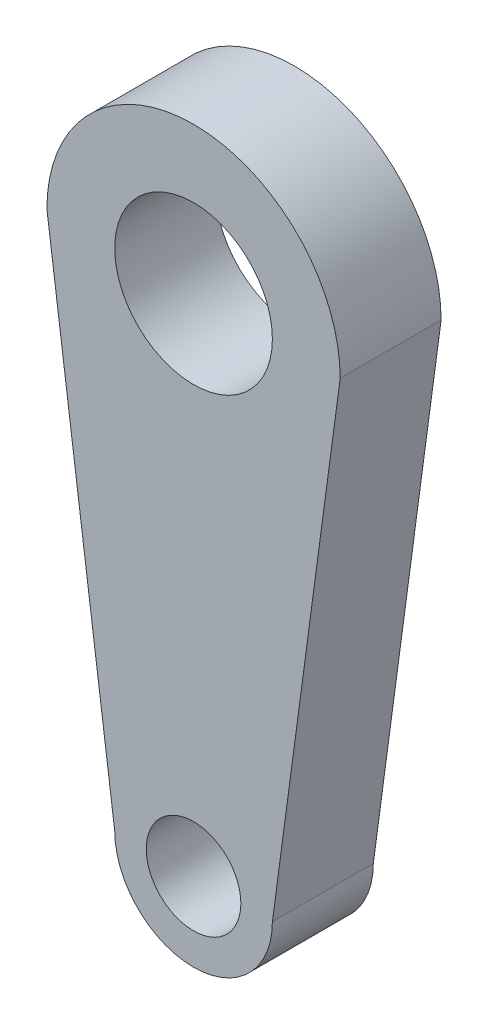
ISO-10303-21;
HEADER;
FILE_DESCRIPTION(('STEP AP214'),'2;1');
FILE_NAME('part.step','',(''),(''),'','','');
FILE_SCHEMA(('AUTOMOTIVE_DESIGN { 1 0 10303 214 1 1 1 1 }'));
ENDSEC;
DATA;
#1=APPLICATION_CONTEXT('core data for automotive mechanical design processes');
#2=APPLICATION_PROTOCOL_DEFINITION('international standard','automotive_design',2000,#1);
#3=PRODUCT_CONTEXT('',#1,'mechanical');
#4=PRODUCT('Part','Part','',(#3));
#5=PRODUCT_RELATED_PRODUCT_CATEGORY('part','',(#4));
#6=PRODUCT_DEFINITION_FORMATION('','',#4);
#7=PRODUCT_DEFINITION_CONTEXT('part definition',#1,'design');
#8=PRODUCT_DEFINITION('design','',#6,#7);
#9=PRODUCT_DEFINITION_SHAPE('','',#8);
#10=(LENGTH_UNIT() NAMED_UNIT(*) SI_UNIT(.MILLI.,.METRE.));
#11=(NAMED_UNIT(*) PLANE_ANGLE_UNIT() SI_UNIT($,.RADIAN.));
#12=(NAMED_UNIT(*) SI_UNIT($,.STERADIAN.) SOLID_ANGLE_UNIT());
#13=UNCERTAINTY_MEASURE_WITH_UNIT(LENGTH_MEASURE(1.E-05),#10,'distance_accuracy_value','');
#14=(GEOMETRIC_REPRESENTATION_CONTEXT(3) GLOBAL_UNCERTAINTY_ASSIGNED_CONTEXT((#13)) GLOBAL_UNIT_ASSIGNED_CONTEXT((#10,
#11,#12)) REPRESENTATION_CONTEXT('',''));
#15=CARTESIAN_POINT('',(0.,0.,0.));
#16=DIRECTION('',(0.,0.,1.));
#17=DIRECTION('',(1.,0.,0.));
#18=AXIS2_PLACEMENT_3D('',#15,#16,#17);
#19=CARTESIAN_POINT('',(0.,5.425,3.2));
#20=DIRECTION('',(0.,0.,1.));
#21=DIRECTION('',(1.,0.,0.));
#22=AXIS2_PLACEMENT_3D('',#19,#20,#21);
#23=PLANE('',#22);
#24=CARTESIAN_POINT('',(0.,-10.575,3.2));
#25=DIRECTION('',(0.,0.,1.));
#26=DIRECTION('',(1.,0.,0.));
#27=AXIS2_PLACEMENT_3D('',#24,#25,#26);
#28=CIRCLE('',#27,1.5);
#29=CARTESIAN_POINT('',(1.5,-10.575,3.2));
#30=VERTEX_POINT('',#29);
#31=EDGE_CURVE('E118',#30,#30,#28,.T.);
#32=ORIENTED_EDGE('',*,*,#31,.F.);
#33=EDGE_LOOP('',(#32));
#34=FACE_BOUND('',#33,.T.);
#35=CARTESIAN_POINT('',(0.,5.425,3.2));
#36=DIRECTION('',(0.,0.,1.));
#37=DIRECTION('',(1.,0.,0.));
#38=AXIS2_PLACEMENT_3D('',#35,#36,#37);
#39=CIRCLE('',#38,4.65);
#40=CARTESIAN_POINT('',(4.65,5.425,3.2));
#41=VERTEX_POINT('',#40);
#42=CARTESIAN_POINT('',(-4.65,5.42499999999997,3.2));
#43=VERTEX_POINT('',#42);
#44=EDGE_CURVE('E98',#41,#43,#39,.T.);
#45=ORIENTED_EDGE('',*,*,#44,.T.);
#46=DIRECTION('',(0.133178005557701,-0.99109213438291,0.));
#47=VECTOR('',#46,1.);
#48=CARTESIAN_POINT('',(-4.65,5.42499999999997,3.2));
#49=LINE('',#48,#47);
#50=CARTESIAN_POINT('',(-2.50000000000005,-10.575,3.2));
#51=VERTEX_POINT('',#50);
#52=EDGE_CURVE('E93',#43,#51,#49,.T.);
#53=ORIENTED_EDGE('',*,*,#52,.T.);
#54=CARTESIAN_POINT('',(0.,-10.575,3.2));
#55=DIRECTION('',(0.,0.,1.));
#56=DIRECTION('',(1.,0.,0.));
#57=AXIS2_PLACEMENT_3D('',#54,#55,#56);
#58=CIRCLE('',#57,2.50000000000005);
#59=CARTESIAN_POINT('',(2.50000000000005,-10.575,3.2));
#60=VERTEX_POINT('',#59);
#61=EDGE_CURVE('E96',#51,#60,#58,.T.);
#62=ORIENTED_EDGE('',*,*,#61,.T.);
#63=DIRECTION('',(0.133178005557701,0.99109213438291,0.));
#64=VECTOR('',#63,1.);
#65=CARTESIAN_POINT('',(4.65,5.425,3.2));
#66=LINE('',#65,#64);
#67=EDGE_CURVE('E63',#60,#41,#66,.T.);
#68=ORIENTED_EDGE('',*,*,#67,.T.);
#69=EDGE_LOOP('',(#45,#53,#62,#68));
#70=FACE_BOUND('',#69,.T.);
#71=CARTESIAN_POINT('',(0.,5.425,3.2));
#72=DIRECTION('',(0.,0.,1.));
#73=DIRECTION('',(1.,0.,0.));
#74=AXIS2_PLACEMENT_3D('',#71,#72,#73);
#75=CIRCLE('',#74,2.5);
#76=CARTESIAN_POINT('',(2.5,5.425,3.2));
#77=VERTEX_POINT('',#76);
#78=EDGE_CURVE('E140',#77,#77,#75,.T.);
#79=ORIENTED_EDGE('',*,*,#78,.F.);
#80=EDGE_LOOP('',(#79));
#81=FACE_BOUND('',#80,.T.);
#82=ADVANCED_FACE('F45',(#34,#70,#81),#23,.T.);
#83=CARTESIAN_POINT('',(0.,5.425,0.));
#84=DIRECTION('',(0.,0.,1.));
#85=DIRECTION('',(1.,0.,0.));
#86=AXIS2_PLACEMENT_3D('',#83,#84,#85);
#87=PLANE('',#86);
#88=CARTESIAN_POINT('',(0.,5.425,0.));
#89=DIRECTION('',(0.,0.,1.));
#90=DIRECTION('',(1.,0.,0.));
#91=AXIS2_PLACEMENT_3D('',#88,#89,#90);
#92=CIRCLE('',#91,4.65);
#93=CARTESIAN_POINT('',(4.65,5.425,0.));
#94=VERTEX_POINT('',#93);
#95=CARTESIAN_POINT('',(-4.65,5.42499999999997,0.));
#96=VERTEX_POINT('',#95);
#97=EDGE_CURVE('E114',#94,#96,#92,.T.);
#98=ORIENTED_EDGE('',*,*,#97,.F.);
#99=DIRECTION('',(0.133178005557701,0.99109213438291,0.));
#100=VECTOR('',#99,1.);
#101=CARTESIAN_POINT('',(4.65,5.425,0.));
#102=LINE('',#101,#100);
#103=CARTESIAN_POINT('',(2.50000000000005,-10.575,0.));
#104=VERTEX_POINT('',#103);
#105=EDGE_CURVE('E86',#104,#94,#102,.T.);
#106=ORIENTED_EDGE('',*,*,#105,.F.);
#107=CARTESIAN_POINT('',(0.,-10.575,0.));
#108=DIRECTION('',(0.,0.,1.));
#109=DIRECTION('',(1.,0.,0.));
#110=AXIS2_PLACEMENT_3D('',#107,#108,#109);
#111=CIRCLE('',#110,2.50000000000005);
#112=CARTESIAN_POINT('',(-2.50000000000005,-10.575,0.));
#113=VERTEX_POINT('',#112);
#114=EDGE_CURVE('E80',#113,#104,#111,.T.);
#115=ORIENTED_EDGE('',*,*,#114,.F.);
#116=DIRECTION('',(0.133178005557701,-0.99109213438291,0.));
#117=VECTOR('',#116,1.);
#118=CARTESIAN_POINT('',(-4.65,5.42499999999997,0.));
#119=LINE('',#118,#117);
#120=EDGE_CURVE('E103',#96,#113,#119,.T.);
#121=ORIENTED_EDGE('',*,*,#120,.F.);
#122=EDGE_LOOP('',(#98,#106,#115,#121));
#123=FACE_BOUND('',#122,.T.);
#124=CARTESIAN_POINT('',(0.,-10.575,0.));
#125=DIRECTION('',(0.,0.,1.));
#126=DIRECTION('',(1.,0.,0.));
#127=AXIS2_PLACEMENT_3D('',#124,#125,#126);
#128=CIRCLE('',#127,1.5);
#129=CARTESIAN_POINT('',(1.5,-10.575,0.));
#130=VERTEX_POINT('',#129);
#131=EDGE_CURVE('E136',#130,#130,#128,.T.);
#132=ORIENTED_EDGE('',*,*,#131,.T.);
#133=EDGE_LOOP('',(#132));
#134=FACE_BOUND('',#133,.T.);
#135=CARTESIAN_POINT('',(0.,5.425,0.));
#136=DIRECTION('',(0.,0.,1.));
#137=DIRECTION('',(1.,0.,0.));
#138=AXIS2_PLACEMENT_3D('',#135,#136,#137);
#139=CIRCLE('',#138,2.5);
#140=CARTESIAN_POINT('',(2.5,5.425,0.));
#141=VERTEX_POINT('',#140);
#142=EDGE_CURVE('E144',#141,#141,#139,.T.);
#143=ORIENTED_EDGE('',*,*,#142,.T.);
#144=EDGE_LOOP('',(#143));
#145=FACE_BOUND('',#144,.T.);
#146=ADVANCED_FACE('F131',(#123,#134,#145),#87,.F.);
#147=CARTESIAN_POINT('',(0.,5.425,3.2));
#148=DIRECTION('',(0.,0.,-1.));
#149=DIRECTION('',(-1.,0.,0.));
#150=AXIS2_PLACEMENT_3D('',#147,#148,#149);
#151=CYLINDRICAL_SURFACE('',#150,4.65);
#152=ORIENTED_EDGE('',*,*,#97,.T.);
#153=DIRECTION('',(0.,0.,-1.));
#154=VECTOR('',#153,1.);
#155=CARTESIAN_POINT('',(-4.65,5.42499999999997,3.2));
#156=LINE('',#155,#154);
#157=EDGE_CURVE('E11',#43,#96,#156,.T.);
#158=ORIENTED_EDGE('',*,*,#157,.F.);
#159=ORIENTED_EDGE('',*,*,#44,.F.);
#160=DIRECTION('',(0.,0.,-1.));
#161=VECTOR('',#160,1.);
#162=CARTESIAN_POINT('',(4.65,5.425,3.2));
#163=LINE('',#162,#161);
#164=EDGE_CURVE('E110',#41,#94,#163,.T.);
#165=ORIENTED_EDGE('',*,*,#164,.T.);
#166=EDGE_LOOP('',(#152,#158,#159,#165));
#167=FACE_BOUND('',#166,.T.);
#168=ADVANCED_FACE('F47',(#167),#151,.T.);
#169=CARTESIAN_POINT('',(-4.65,5.42499999999997,3.2));
#170=DIRECTION('',(0.99109213438291,0.133178005557701,0.));
#171=DIRECTION('',(-0.133178005557701,0.991092134382911,0.));
#172=AXIS2_PLACEMENT_3D('',#169,#170,#171);
#173=PLANE('',#172);
#174=ORIENTED_EDGE('',*,*,#120,.T.);
#175=DIRECTION('',(0.,0.,-1.));
#176=VECTOR('',#175,1.);
#177=CARTESIAN_POINT('',(-2.50000000000005,-10.575,3.2));
#178=LINE('',#177,#176);
#179=EDGE_CURVE('E55',#51,#113,#178,.T.);
#180=ORIENTED_EDGE('',*,*,#179,.F.);
#181=ORIENTED_EDGE('',*,*,#52,.F.);
#182=ORIENTED_EDGE('',*,*,#157,.T.);
#183=EDGE_LOOP('',(#174,#180,#181,#182));
#184=FACE_BOUND('',#183,.T.);
#185=ADVANCED_FACE('F102',(#184),#173,.F.);
#186=CARTESIAN_POINT('',(0.,-10.575,3.2));
#187=DIRECTION('',(0.,0.,-1.));
#188=DIRECTION('',(-1.,0.,0.));
#189=AXIS2_PLACEMENT_3D('',#186,#187,#188);
#190=CYLINDRICAL_SURFACE('',#189,2.50000000000005);
#191=ORIENTED_EDGE('',*,*,#114,.T.);
#192=DIRECTION('',(0.,0.,-1.));
#193=VECTOR('',#192,1.);
#194=CARTESIAN_POINT('',(2.50000000000005,-10.575,3.2));
#195=LINE('',#194,#193);
#196=EDGE_CURVE('E105',#60,#104,#195,.T.);
#197=ORIENTED_EDGE('',*,*,#196,.F.);
#198=ORIENTED_EDGE('',*,*,#61,.F.);
#199=ORIENTED_EDGE('',*,*,#179,.T.);
#200=EDGE_LOOP('',(#191,#197,#198,#199));
#201=FACE_BOUND('',#200,.T.);
#202=ADVANCED_FACE('F106',(#201),#190,.T.);
#203=CARTESIAN_POINT('',(4.65,5.425,3.2));
#204=DIRECTION('',(-0.99109213438291,0.133178005557701,0.));
#205=DIRECTION('',(-0.133178005557701,-0.991092134382911,0.));
#206=AXIS2_PLACEMENT_3D('',#203,#204,#205);
#207=PLANE('',#206);
#208=ORIENTED_EDGE('',*,*,#105,.T.);
#209=ORIENTED_EDGE('',*,*,#164,.F.);
#210=ORIENTED_EDGE('',*,*,#67,.F.);
#211=ORIENTED_EDGE('',*,*,#196,.T.);
#212=EDGE_LOOP('',(#208,#209,#210,#211));
#213=FACE_BOUND('',#212,.T.);
#214=ADVANCED_FACE('F128',(#213),#207,.F.);
#215=CARTESIAN_POINT('',(0.,-10.575,3.2));
#216=DIRECTION('',(0.,0.,-1.));
#217=DIRECTION('',(-1.,0.,0.));
#218=AXIS2_PLACEMENT_3D('',#215,#216,#217);
#219=CYLINDRICAL_SURFACE('',#218,1.5);
#220=ORIENTED_EDGE('',*,*,#31,.T.);
#221=EDGE_LOOP('',(#220));
#222=FACE_BOUND('',#221,.T.);
#223=ORIENTED_EDGE('',*,*,#131,.F.);
#224=EDGE_LOOP('',(#223));
#225=FACE_BOUND('',#224,.T.);
#226=ADVANCED_FACE('F163',(#222,#225),#219,.F.);
#227=CARTESIAN_POINT('',(0.,5.425,3.2));
#228=DIRECTION('',(0.,0.,-1.));
#229=DIRECTION('',(-1.,0.,0.));
#230=AXIS2_PLACEMENT_3D('',#227,#228,#229);
#231=CYLINDRICAL_SURFACE('',#230,2.5);
#232=ORIENTED_EDGE('',*,*,#78,.T.);
#233=EDGE_LOOP('',(#232));
#234=FACE_BOUND('',#233,.T.);
#235=ORIENTED_EDGE('',*,*,#142,.F.);
#236=EDGE_LOOP('',(#235));
#237=FACE_BOUND('',#236,.T.);
#238=ADVANCED_FACE('F152',(#234,#237),#231,.F.);
#239=CLOSED_SHELL('',(#82,#146,#168,#185,#202,#214,#226,#238));
#240=MANIFOLD_SOLID_BREP('B2',#239);
#241=ADVANCED_BREP_SHAPE_REPRESENTATION('',(#18,#240),#14);
#242=SHAPE_DEFINITION_REPRESENTATION(#9,#241);
ENDSEC;
END-ISO-10303-21;
